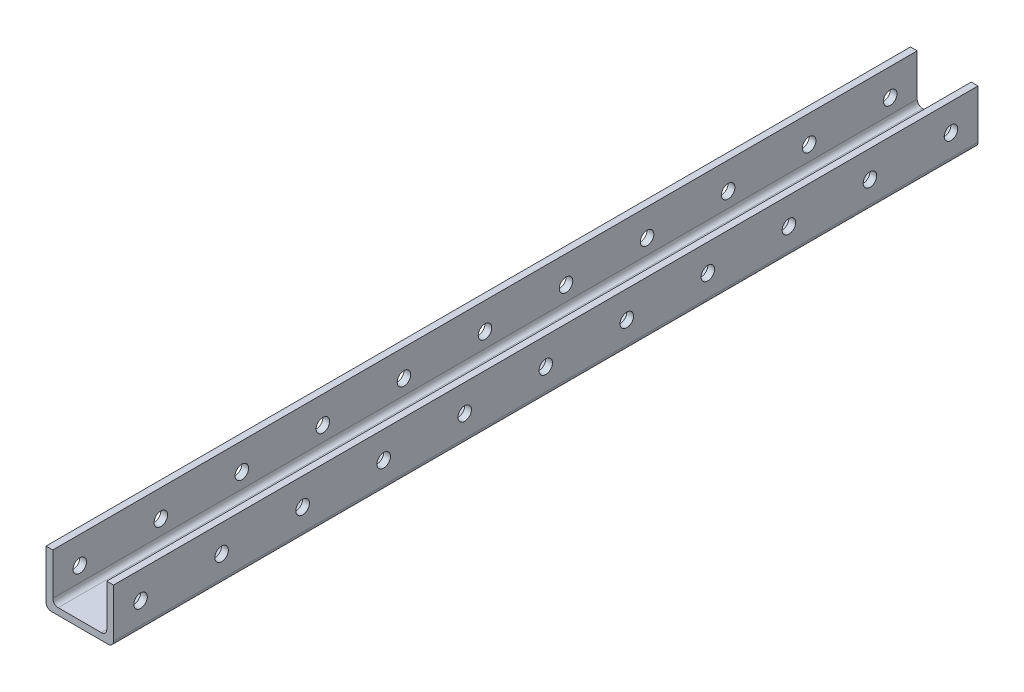
ISO-10303-21;
HEADER;
FILE_DESCRIPTION(('STEP AP214'),'2;1');
FILE_NAME('part.step','',(''),(''),'','','');
FILE_SCHEMA(('AUTOMOTIVE_DESIGN { 1 0 10303 214 1 1 1 1 }'));
ENDSEC;
DATA;
#1=APPLICATION_CONTEXT('core data for automotive mechanical design processes');
#2=APPLICATION_PROTOCOL_DEFINITION('international standard','automotive_design',2000,#1);
#3=PRODUCT_CONTEXT('',#1,'mechanical');
#4=PRODUCT('Part','Part','',(#3));
#5=PRODUCT_RELATED_PRODUCT_CATEGORY('part','',(#4));
#6=PRODUCT_DEFINITION_FORMATION('','',#4);
#7=PRODUCT_DEFINITION_CONTEXT('part definition',#1,'design');
#8=PRODUCT_DEFINITION('design','',#6,#7);
#9=PRODUCT_DEFINITION_SHAPE('','',#8);
#10=(LENGTH_UNIT() NAMED_UNIT(*) SI_UNIT(.MILLI.,.METRE.));
#11=(NAMED_UNIT(*) PLANE_ANGLE_UNIT() SI_UNIT($,.RADIAN.));
#12=(NAMED_UNIT(*) SI_UNIT($,.STERADIAN.) SOLID_ANGLE_UNIT());
#13=UNCERTAINTY_MEASURE_WITH_UNIT(LENGTH_MEASURE(1.E-05),#10,'distance_accuracy_value','');
#14=(GEOMETRIC_REPRESENTATION_CONTEXT(3) GLOBAL_UNCERTAINTY_ASSIGNED_CONTEXT((#13)) GLOBAL_UNIT_ASSIGNED_CONTEXT((#10,
#11,#12)) REPRESENTATION_CONTEXT('',''));
#15=CARTESIAN_POINT('',(0.,0.,0.));
#16=DIRECTION('',(0.,0.,1.));
#17=DIRECTION('',(1.,0.,0.));
#18=AXIS2_PLACEMENT_3D('',#15,#16,#17);
#19=CARTESIAN_POINT('',(0.,25.4,0.));
#20=DIRECTION('',(0.,-1.,0.));
#21=DIRECTION('',(0.,0.,-1.));
#22=AXIS2_PLACEMENT_3D('',#19,#20,#21);
#23=PLANE('',#22);
#24=DIRECTION('',(1.,0.,0.));
#25=VECTOR('',#24,1.);
#26=CARTESIAN_POINT('',(-15.875,25.4,203.2));
#27=LINE('',#26,#25);
#28=CARTESIAN_POINT('',(-15.875,25.4,203.2));
#29=VERTEX_POINT('',#28);
#30=CARTESIAN_POINT('',(-12.7,25.4,203.2));
#31=VERTEX_POINT('',#30);
#32=EDGE_CURVE('E158',#29,#31,#27,.T.);
#33=ORIENTED_EDGE('',*,*,#32,.T.);
#34=DIRECTION('',(0.,0.,1.));
#35=VECTOR('',#34,1.);
#36=CARTESIAN_POINT('',(-12.7,25.4,-203.2));
#37=LINE('',#36,#35);
#38=CARTESIAN_POINT('',(-12.7,25.4,-203.2));
#39=VERTEX_POINT('',#38);
#40=EDGE_CURVE('E145',#39,#31,#37,.T.);
#41=ORIENTED_EDGE('',*,*,#40,.F.);
#42=DIRECTION('',(-1.,0.,0.));
#43=VECTOR('',#42,1.);
#44=CARTESIAN_POINT('',(-15.875,25.4,-203.2));
#45=LINE('',#44,#43);
#46=CARTESIAN_POINT('',(-15.875,25.4,-203.2));
#47=VERTEX_POINT('',#46);
#48=EDGE_CURVE('E152',#39,#47,#45,.T.);
#49=ORIENTED_EDGE('',*,*,#48,.T.);
#50=DIRECTION('',(0.,0.,1.));
#51=VECTOR('',#50,1.);
#52=CARTESIAN_POINT('',(-15.875,25.4,203.2));
#53=LINE('',#52,#51);
#54=EDGE_CURVE('E151',#47,#29,#53,.T.);
#55=ORIENTED_EDGE('',*,*,#54,.T.);
#56=EDGE_LOOP('',(#33,#41,#49,#55));
#57=FACE_BOUND('',#56,.T.);
#58=ADVANCED_FACE('F33',(#57),#23,.F.);
#59=CARTESIAN_POINT('',(15.875,25.4,203.2));
#60=DIRECTION('',(-1.,0.,0.));
#61=DIRECTION('',(0.,0.,1.));
#62=AXIS2_PLACEMENT_3D('',#59,#60,#61);
#63=PLANE('',#62);
#64=CARTESIAN_POINT('',(15.875,12.7,-190.5));
#65=DIRECTION('',(1.,0.,0.));
#66=DIRECTION('',(0.,0.,-1.));
#67=AXIS2_PLACEMENT_3D('',#64,#65,#66);
#68=CIRCLE('',#67,3.175);
#69=CARTESIAN_POINT('',(15.875,12.7,-193.675));
#70=VERTEX_POINT('',#69);
#71=EDGE_CURVE('E512',#70,#70,#68,.T.);
#72=ORIENTED_EDGE('',*,*,#71,.F.);
#73=EDGE_LOOP('',(#72));
#74=FACE_BOUND('',#73,.T.);
#75=CARTESIAN_POINT('',(15.875,12.7,-152.4));
#76=DIRECTION('',(1.,0.,0.));
#77=DIRECTION('',(0.,0.,-1.));
#78=AXIS2_PLACEMENT_3D('',#75,#76,#77);
#79=CIRCLE('',#78,3.175);
#80=CARTESIAN_POINT('',(15.875,12.7,-155.575));
#81=VERTEX_POINT('',#80);
#82=EDGE_CURVE('E254',#81,#81,#79,.T.);
#83=ORIENTED_EDGE('',*,*,#82,.F.);
#84=EDGE_LOOP('',(#83));
#85=FACE_BOUND('',#84,.T.);
#86=CARTESIAN_POINT('',(15.875,12.7,-114.3));
#87=DIRECTION('',(1.,0.,0.));
#88=DIRECTION('',(0.,0.,-1.));
#89=AXIS2_PLACEMENT_3D('',#86,#87,#88);
#90=CIRCLE('',#89,3.175);
#91=CARTESIAN_POINT('',(15.875,12.7,-117.475));
#92=VERTEX_POINT('',#91);
#93=EDGE_CURVE('E250',#92,#92,#90,.T.);
#94=ORIENTED_EDGE('',*,*,#93,.F.);
#95=EDGE_LOOP('',(#94));
#96=FACE_BOUND('',#95,.T.);
#97=CARTESIAN_POINT('',(15.875,12.7,-76.2000000000001));
#98=DIRECTION('',(1.,0.,0.));
#99=DIRECTION('',(0.,0.,-1.));
#100=AXIS2_PLACEMENT_3D('',#97,#98,#99);
#101=CIRCLE('',#100,3.175);
#102=CARTESIAN_POINT('',(15.875,12.7,-79.3750000000001));
#103=VERTEX_POINT('',#102);
#104=EDGE_CURVE('E246',#103,#103,#101,.T.);
#105=ORIENTED_EDGE('',*,*,#104,.F.);
#106=EDGE_LOOP('',(#105));
#107=FACE_BOUND('',#106,.T.);
#108=CARTESIAN_POINT('',(15.875,12.7,-38.1000000000001));
#109=DIRECTION('',(1.,0.,0.));
#110=DIRECTION('',(0.,0.,-1.));
#111=AXIS2_PLACEMENT_3D('',#108,#109,#110);
#112=CIRCLE('',#111,3.175);
#113=CARTESIAN_POINT('',(15.875,12.7,-41.2750000000001));
#114=VERTEX_POINT('',#113);
#115=EDGE_CURVE('E241',#114,#114,#112,.T.);
#116=ORIENTED_EDGE('',*,*,#115,.F.);
#117=EDGE_LOOP('',(#116));
#118=FACE_BOUND('',#117,.T.);
#119=CARTESIAN_POINT('',(15.875,12.7,-1.11022302462516E-13));
#120=DIRECTION('',(1.,0.,0.));
#121=DIRECTION('',(0.,0.,-1.));
#122=AXIS2_PLACEMENT_3D('',#119,#120,#121);
#123=CIRCLE('',#122,3.175);
#124=CARTESIAN_POINT('',(15.875,12.7,-3.17500000000011));
#125=VERTEX_POINT('',#124);
#126=EDGE_CURVE('E236',#125,#125,#123,.T.);
#127=ORIENTED_EDGE('',*,*,#126,.F.);
#128=EDGE_LOOP('',(#127));
#129=FACE_BOUND('',#128,.T.);
#130=CARTESIAN_POINT('',(15.875,12.7,38.0999999999999));
#131=DIRECTION('',(1.,0.,0.));
#132=DIRECTION('',(0.,0.,-1.));
#133=AXIS2_PLACEMENT_3D('',#130,#131,#132);
#134=CIRCLE('',#133,3.175);
#135=CARTESIAN_POINT('',(15.875,12.7,34.9249999999999));
#136=VERTEX_POINT('',#135);
#137=EDGE_CURVE('E231',#136,#136,#134,.T.);
#138=ORIENTED_EDGE('',*,*,#137,.F.);
#139=EDGE_LOOP('',(#138));
#140=FACE_BOUND('',#139,.T.);
#141=CARTESIAN_POINT('',(15.875,12.7,76.1999999999999));
#142=DIRECTION('',(1.,0.,0.));
#143=DIRECTION('',(0.,0.,-1.));
#144=AXIS2_PLACEMENT_3D('',#141,#142,#143);
#145=CIRCLE('',#144,3.175);
#146=CARTESIAN_POINT('',(15.875,12.7,73.0249999999999));
#147=VERTEX_POINT('',#146);
#148=EDGE_CURVE('E226',#147,#147,#145,.T.);
#149=ORIENTED_EDGE('',*,*,#148,.F.);
#150=EDGE_LOOP('',(#149));
#151=FACE_BOUND('',#150,.T.);
#152=CARTESIAN_POINT('',(15.875,12.7,114.3));
#153=DIRECTION('',(1.,0.,0.));
#154=DIRECTION('',(0.,0.,-1.));
#155=AXIS2_PLACEMENT_3D('',#152,#153,#154);
#156=CIRCLE('',#155,3.175);
#157=CARTESIAN_POINT('',(15.875,12.7,111.125));
#158=VERTEX_POINT('',#157);
#159=EDGE_CURVE('E221',#158,#158,#156,.T.);
#160=ORIENTED_EDGE('',*,*,#159,.F.);
#161=EDGE_LOOP('',(#160));
#162=FACE_BOUND('',#161,.T.);
#163=CARTESIAN_POINT('',(15.875,12.7,152.4));
#164=DIRECTION('',(1.,0.,0.));
#165=DIRECTION('',(0.,0.,-1.));
#166=AXIS2_PLACEMENT_3D('',#163,#164,#165);
#167=CIRCLE('',#166,3.175);
#168=CARTESIAN_POINT('',(15.875,12.7,149.225));
#169=VERTEX_POINT('',#168);
#170=EDGE_CURVE('E216',#169,#169,#167,.T.);
#171=ORIENTED_EDGE('',*,*,#170,.F.);
#172=EDGE_LOOP('',(#171));
#173=FACE_BOUND('',#172,.T.);
#174=CARTESIAN_POINT('',(15.875,12.7,190.5));
#175=DIRECTION('',(1.,0.,0.));
#176=DIRECTION('',(0.,0.,-1.));
#177=AXIS2_PLACEMENT_3D('',#174,#175,#176);
#178=CIRCLE('',#177,3.175);
#179=CARTESIAN_POINT('',(15.875,12.7,187.325));
#180=VERTEX_POINT('',#179);
#181=EDGE_CURVE('E211',#180,#180,#178,.T.);
#182=ORIENTED_EDGE('',*,*,#181,.F.);
#183=EDGE_LOOP('',(#182));
#184=FACE_BOUND('',#183,.T.);
#185=DIRECTION('',(0.,-1.,0.));
#186=VECTOR('',#185,1.);
#187=CARTESIAN_POINT('',(15.875,25.4,203.2));
#188=LINE('',#187,#186);
#189=CARTESIAN_POINT('',(15.875,25.4,203.2));
#190=VERTEX_POINT('',#189);
#191=CARTESIAN_POINT('',(15.875,2.54,203.2));
#192=VERTEX_POINT('',#191);
#193=EDGE_CURVE('E161',#190,#192,#188,.T.);
#194=ORIENTED_EDGE('',*,*,#193,.T.);
#195=DIRECTION('',(0.,0.,-1.));
#196=VECTOR('',#195,1.);
#197=CARTESIAN_POINT('',(15.875,2.54,-203.2));
#198=LINE('',#197,#196);
#199=CARTESIAN_POINT('',(15.875,2.54,-203.2));
#200=VERTEX_POINT('',#199);
#201=EDGE_CURVE('E192',#192,#200,#198,.T.);
#202=ORIENTED_EDGE('',*,*,#201,.T.);
#203=DIRECTION('',(0.,-1.,0.));
#204=VECTOR('',#203,1.);
#205=CARTESIAN_POINT('',(15.875,25.4,-203.2));
#206=LINE('',#205,#204);
#207=CARTESIAN_POINT('',(15.875,25.4,-203.2));
#208=VERTEX_POINT('',#207);
#209=EDGE_CURVE('E175',#208,#200,#206,.T.);
#210=ORIENTED_EDGE('',*,*,#209,.F.);
#211=DIRECTION('',(0.,0.,-1.));
#212=VECTOR('',#211,1.);
#213=CARTESIAN_POINT('',(15.875,25.4,203.2));
#214=LINE('',#213,#212);
#215=EDGE_CURVE('E149',#190,#208,#214,.T.);
#216=ORIENTED_EDGE('',*,*,#215,.F.);
#217=EDGE_LOOP('',(#194,#202,#210,#216));
#218=FACE_BOUND('',#217,.T.);
#219=ADVANCED_FACE('F371',(#74,#85,#96,#107,#118,#129,#140,#151,#162,#173,#184,#218),#63,.F.);
#220=CARTESIAN_POINT('',(-15.875,25.4,-203.2));
#221=DIRECTION('',(0.,0.,1.));
#222=DIRECTION('',(1.,0.,0.));
#223=AXIS2_PLACEMENT_3D('',#220,#221,#222);
#224=PLANE('',#223);
#225=DIRECTION('',(-1.,0.,0.));
#226=VECTOR('',#225,1.);
#227=CARTESIAN_POINT('',(-15.875,0.,-203.2));
#228=LINE('',#227,#226);
#229=CARTESIAN_POINT('',(13.335,0.,-203.2));
#230=VERTEX_POINT('',#229);
#231=CARTESIAN_POINT('',(-13.335,0.,-203.2));
#232=VERTEX_POINT('',#231);
#233=EDGE_CURVE('E162',#230,#232,#228,.T.);
#234=ORIENTED_EDGE('',*,*,#233,.T.);
#235=CARTESIAN_POINT('',(-13.335,2.54,-203.2));
#236=DIRECTION('',(0.,0.,1.));
#237=DIRECTION('',(1.,0.,0.));
#238=AXIS2_PLACEMENT_3D('',#235,#236,#237);
#239=CIRCLE('',#238,2.54);
#240=CARTESIAN_POINT('',(-15.875,2.54,-203.2));
#241=VERTEX_POINT('',#240);
#242=EDGE_CURVE('E190',#232,#241,#239,.F.);
#243=ORIENTED_EDGE('',*,*,#242,.T.);
#244=DIRECTION('',(0.,-1.,0.));
#245=VECTOR('',#244,1.);
#246=CARTESIAN_POINT('',(-15.875,25.4,-203.2));
#247=LINE('',#246,#245);
#248=EDGE_CURVE('E172',#47,#241,#247,.T.);
#249=ORIENTED_EDGE('',*,*,#248,.F.);
#250=ORIENTED_EDGE('',*,*,#48,.F.);
#251=DIRECTION('',(0.,-1.,0.));
#252=VECTOR('',#251,1.);
#253=CARTESIAN_POINT('',(-12.7,25.4,-203.2));
#254=LINE('',#253,#252);
#255=CARTESIAN_POINT('',(-12.7,5.715,-203.2));
#256=VERTEX_POINT('',#255);
#257=EDGE_CURVE('E336',#39,#256,#254,.T.);
#258=ORIENTED_EDGE('',*,*,#257,.T.);
#259=CARTESIAN_POINT('',(-10.16,5.715,-203.2));
#260=DIRECTION('',(0.,0.,1.));
#261=DIRECTION('',(1.,0.,0.));
#262=AXIS2_PLACEMENT_3D('',#259,#260,#261);
#263=CIRCLE('',#262,2.54);
#264=CARTESIAN_POINT('',(-10.16,3.175,-203.2));
#265=VERTEX_POINT('',#264);
#266=EDGE_CURVE('E11',#256,#265,#263,.T.);
#267=ORIENTED_EDGE('',*,*,#266,.T.);
#268=DIRECTION('',(1.,0.,0.));
#269=VECTOR('',#268,1.);
#270=CARTESIAN_POINT('',(-12.7,3.175,-203.2));
#271=LINE('',#270,#269);
#272=CARTESIAN_POINT('',(10.16,3.175,-203.2));
#273=VERTEX_POINT('',#272);
#274=EDGE_CURVE('E137',#265,#273,#271,.T.);
#275=ORIENTED_EDGE('',*,*,#274,.T.);
#276=CARTESIAN_POINT('',(10.16,5.715,-203.2));
#277=DIRECTION('',(0.,0.,1.));
#278=DIRECTION('',(1.,0.,0.));
#279=AXIS2_PLACEMENT_3D('',#276,#277,#278);
#280=CIRCLE('',#279,2.54);
#281=CARTESIAN_POINT('',(12.7,5.715,-203.2));
#282=VERTEX_POINT('',#281);
#283=EDGE_CURVE('E132',#273,#282,#280,.T.);
#284=ORIENTED_EDGE('',*,*,#283,.T.);
#285=DIRECTION('',(0.,1.,0.));
#286=VECTOR('',#285,1.);
#287=CARTESIAN_POINT('',(12.7,25.4,-203.2));
#288=LINE('',#287,#286);
#289=CARTESIAN_POINT('',(12.7,25.4,-203.2));
#290=VERTEX_POINT('',#289);
#291=EDGE_CURVE('E122',#282,#290,#288,.T.);
#292=ORIENTED_EDGE('',*,*,#291,.T.);
#293=EDGE_CURVE('E128',#208,#290,#45,.T.);
#294=ORIENTED_EDGE('',*,*,#293,.F.);
#295=ORIENTED_EDGE('',*,*,#209,.T.);
#296=CARTESIAN_POINT('',(13.335,2.54,-203.2));
#297=DIRECTION('',(0.,0.,1.));
#298=DIRECTION('',(1.,0.,0.));
#299=AXIS2_PLACEMENT_3D('',#296,#297,#298);
#300=CIRCLE('',#299,2.54);
#301=EDGE_CURVE('E188',#200,#230,#300,.F.);
#302=ORIENTED_EDGE('',*,*,#301,.T.);
#303=EDGE_LOOP('',(#234,#243,#249,#250,#258,#267,#275,#284,#292,#294,#295,#302));
#304=FACE_BOUND('',#303,.T.);
#305=ADVANCED_FACE('F125',(#304),#224,.F.);
#306=CARTESIAN_POINT('',(-15.875,25.4,203.2));
#307=DIRECTION('',(1.,0.,0.));
#308=DIRECTION('',(0.,0.,-1.));
#309=AXIS2_PLACEMENT_3D('',#306,#307,#308);
#310=PLANE('',#309);
#311=CARTESIAN_POINT('',(-15.875,12.7,-190.5));
#312=DIRECTION('',(1.,0.,0.));
#313=DIRECTION('',(0.,0.,-1.));
#314=AXIS2_PLACEMENT_3D('',#311,#312,#313);
#315=CIRCLE('',#314,3.175);
#316=CARTESIAN_POINT('',(-15.875,12.7,-193.675));
#317=VERTEX_POINT('',#316);
#318=EDGE_CURVE('E261',#317,#317,#315,.T.);
#319=ORIENTED_EDGE('',*,*,#318,.T.);
#320=EDGE_LOOP('',(#319));
#321=FACE_BOUND('',#320,.T.);
#322=CARTESIAN_POINT('',(-15.875,12.7,-152.4));
#323=DIRECTION('',(1.,0.,0.));
#324=DIRECTION('',(0.,0.,-1.));
#325=AXIS2_PLACEMENT_3D('',#322,#323,#324);
#326=CIRCLE('',#325,3.175);
#327=CARTESIAN_POINT('',(-15.875,12.7,-155.575));
#328=VERTEX_POINT('',#327);
#329=EDGE_CURVE('E258',#328,#328,#326,.T.);
#330=ORIENTED_EDGE('',*,*,#329,.T.);
#331=EDGE_LOOP('',(#330));
#332=FACE_BOUND('',#331,.T.);
#333=CARTESIAN_POINT('',(-15.875,12.7,-114.3));
#334=DIRECTION('',(1.,0.,0.));
#335=DIRECTION('',(0.,0.,-1.));
#336=AXIS2_PLACEMENT_3D('',#333,#334,#335);
#337=CIRCLE('',#336,3.175);
#338=CARTESIAN_POINT('',(-15.875,12.7,-117.475));
#339=VERTEX_POINT('',#338);
#340=EDGE_CURVE('E276',#339,#339,#337,.T.);
#341=ORIENTED_EDGE('',*,*,#340,.T.);
#342=EDGE_LOOP('',(#341));
#343=FACE_BOUND('',#342,.T.);
#344=CARTESIAN_POINT('',(-15.875,12.7,-76.2000000000001));
#345=DIRECTION('',(1.,0.,0.));
#346=DIRECTION('',(0.,0.,-1.));
#347=AXIS2_PLACEMENT_3D('',#344,#345,#346);
#348=CIRCLE('',#347,3.175);
#349=CARTESIAN_POINT('',(-15.875,12.7,-79.3750000000001));
#350=VERTEX_POINT('',#349);
#351=EDGE_CURVE('E283',#350,#350,#348,.T.);
#352=ORIENTED_EDGE('',*,*,#351,.T.);
#353=EDGE_LOOP('',(#352));
#354=FACE_BOUND('',#353,.T.);
#355=CARTESIAN_POINT('',(-15.875,12.7,-38.1000000000001));
#356=DIRECTION('',(1.,0.,0.));
#357=DIRECTION('',(0.,0.,-1.));
#358=AXIS2_PLACEMENT_3D('',#355,#356,#357);
#359=CIRCLE('',#358,3.175);
#360=CARTESIAN_POINT('',(-15.875,12.7,-41.2750000000001));
#361=VERTEX_POINT('',#360);
#362=EDGE_CURVE('E290',#361,#361,#359,.T.);
#363=ORIENTED_EDGE('',*,*,#362,.T.);
#364=EDGE_LOOP('',(#363));
#365=FACE_BOUND('',#364,.T.);
#366=CARTESIAN_POINT('',(-15.875,12.7,-1.11022302462516E-13));
#367=DIRECTION('',(1.,0.,0.));
#368=DIRECTION('',(0.,0.,-1.));
#369=AXIS2_PLACEMENT_3D('',#366,#367,#368);
#370=CIRCLE('',#369,3.175);
#371=CARTESIAN_POINT('',(-15.875,12.7,-3.17500000000011));
#372=VERTEX_POINT('',#371);
#373=EDGE_CURVE('E297',#372,#372,#370,.T.);
#374=ORIENTED_EDGE('',*,*,#373,.T.);
#375=EDGE_LOOP('',(#374));
#376=FACE_BOUND('',#375,.T.);
#377=CARTESIAN_POINT('',(-15.875,12.7,38.0999999999999));
#378=DIRECTION('',(1.,0.,0.));
#379=DIRECTION('',(0.,0.,-1.));
#380=AXIS2_PLACEMENT_3D('',#377,#378,#379);
#381=CIRCLE('',#380,3.175);
#382=CARTESIAN_POINT('',(-15.875,12.7,34.9249999999999));
#383=VERTEX_POINT('',#382);
#384=EDGE_CURVE('E304',#383,#383,#381,.T.);
#385=ORIENTED_EDGE('',*,*,#384,.T.);
#386=EDGE_LOOP('',(#385));
#387=FACE_BOUND('',#386,.T.);
#388=CARTESIAN_POINT('',(-15.875,12.7,76.1999999999999));
#389=DIRECTION('',(1.,0.,0.));
#390=DIRECTION('',(0.,0.,-1.));
#391=AXIS2_PLACEMENT_3D('',#388,#389,#390);
#392=CIRCLE('',#391,3.175);
#393=CARTESIAN_POINT('',(-15.875,12.7,73.0249999999999));
#394=VERTEX_POINT('',#393);
#395=EDGE_CURVE('E311',#394,#394,#392,.T.);
#396=ORIENTED_EDGE('',*,*,#395,.T.);
#397=EDGE_LOOP('',(#396));
#398=FACE_BOUND('',#397,.T.);
#399=CARTESIAN_POINT('',(-15.875,12.7,114.3));
#400=DIRECTION('',(1.,0.,0.));
#401=DIRECTION('',(0.,0.,-1.));
#402=AXIS2_PLACEMENT_3D('',#399,#400,#401);
#403=CIRCLE('',#402,3.175);
#404=CARTESIAN_POINT('',(-15.875,12.7,111.125));
#405=VERTEX_POINT('',#404);
#406=EDGE_CURVE('E318',#405,#405,#403,.T.);
#407=ORIENTED_EDGE('',*,*,#406,.T.);
#408=EDGE_LOOP('',(#407));
#409=FACE_BOUND('',#408,.T.);
#410=CARTESIAN_POINT('',(-15.875,12.7,152.4));
#411=DIRECTION('',(1.,0.,0.));
#412=DIRECTION('',(0.,0.,-1.));
#413=AXIS2_PLACEMENT_3D('',#410,#411,#412);
#414=CIRCLE('',#413,3.175);
#415=CARTESIAN_POINT('',(-15.875,12.7,149.225));
#416=VERTEX_POINT('',#415);
#417=EDGE_CURVE('E325',#416,#416,#414,.T.);
#418=ORIENTED_EDGE('',*,*,#417,.T.);
#419=EDGE_LOOP('',(#418));
#420=FACE_BOUND('',#419,.T.);
#421=CARTESIAN_POINT('',(-15.875,12.7,190.5));
#422=DIRECTION('',(1.,0.,0.));
#423=DIRECTION('',(0.,0.,-1.));
#424=AXIS2_PLACEMENT_3D('',#421,#422,#423);
#425=CIRCLE('',#424,3.175);
#426=CARTESIAN_POINT('',(-15.875,12.7,187.325));
#427=VERTEX_POINT('',#426);
#428=EDGE_CURVE('E332',#427,#427,#425,.T.);
#429=ORIENTED_EDGE('',*,*,#428,.T.);
#430=EDGE_LOOP('',(#429));
#431=FACE_BOUND('',#430,.T.);
#432=ORIENTED_EDGE('',*,*,#248,.T.);
#433=DIRECTION('',(0.,0.,1.));
#434=VECTOR('',#433,1.);
#435=CARTESIAN_POINT('',(-15.875,2.54,203.2));
#436=LINE('',#435,#434);
#437=CARTESIAN_POINT('',(-15.875,2.54,203.2));
#438=VERTEX_POINT('',#437);
#439=EDGE_CURVE('E177',#241,#438,#436,.T.);
#440=ORIENTED_EDGE('',*,*,#439,.T.);
#441=DIRECTION('',(0.,-1.,0.));
#442=VECTOR('',#441,1.);
#443=CARTESIAN_POINT('',(-15.875,25.4,203.2));
#444=LINE('',#443,#442);
#445=EDGE_CURVE('E169',#29,#438,#444,.T.);
#446=ORIENTED_EDGE('',*,*,#445,.F.);
#447=ORIENTED_EDGE('',*,*,#54,.F.);
#448=EDGE_LOOP('',(#432,#440,#446,#447));
#449=FACE_BOUND('',#448,.T.);
#450=ADVANCED_FACE('F354',(#321,#332,#343,#354,#365,#376,#387,#398,#409,#420,#431,#449),#310,.F.);
#451=CARTESIAN_POINT('',(-15.875,25.4,203.2));
#452=DIRECTION('',(0.,0.,-1.));
#453=DIRECTION('',(-1.,0.,0.));
#454=AXIS2_PLACEMENT_3D('',#451,#452,#453);
#455=PLANE('',#454);
#456=ORIENTED_EDGE('',*,*,#445,.T.);
#457=CARTESIAN_POINT('',(-13.335,2.54,203.2));
#458=DIRECTION('',(0.,0.,-1.));
#459=DIRECTION('',(-1.,0.,0.));
#460=AXIS2_PLACEMENT_3D('',#457,#458,#459);
#461=CIRCLE('',#460,2.54);
#462=CARTESIAN_POINT('',(-13.335,0.,203.2));
#463=VERTEX_POINT('',#462);
#464=EDGE_CURVE('E182',#438,#463,#461,.F.);
#465=ORIENTED_EDGE('',*,*,#464,.T.);
#466=DIRECTION('',(1.,0.,0.));
#467=VECTOR('',#466,1.);
#468=CARTESIAN_POINT('',(-15.875,0.,203.2));
#469=LINE('',#468,#467);
#470=CARTESIAN_POINT('',(13.335,0.,203.2));
#471=VERTEX_POINT('',#470);
#472=EDGE_CURVE('E164',#463,#471,#469,.T.);
#473=ORIENTED_EDGE('',*,*,#472,.T.);
#474=CARTESIAN_POINT('',(13.335,2.54,203.2));
#475=DIRECTION('',(0.,0.,-1.));
#476=DIRECTION('',(-1.,0.,0.));
#477=AXIS2_PLACEMENT_3D('',#474,#475,#476);
#478=CIRCLE('',#477,2.54);
#479=EDGE_CURVE('E180',#471,#192,#478,.F.);
#480=ORIENTED_EDGE('',*,*,#479,.T.);
#481=ORIENTED_EDGE('',*,*,#193,.F.);
#482=CARTESIAN_POINT('',(12.7,25.4,203.2));
#483=VERTEX_POINT('',#482);
#484=EDGE_CURVE('E154',#483,#190,#27,.T.);
#485=ORIENTED_EDGE('',*,*,#484,.F.);
#486=DIRECTION('',(0.,1.,0.));
#487=VECTOR('',#486,1.);
#488=CARTESIAN_POINT('',(12.7,25.4,203.2));
#489=LINE('',#488,#487);
#490=CARTESIAN_POINT('',(12.7,5.715,203.2));
#491=VERTEX_POINT('',#490);
#492=EDGE_CURVE('E142',#491,#483,#489,.T.);
#493=ORIENTED_EDGE('',*,*,#492,.F.);
#494=CARTESIAN_POINT('',(10.16,5.715,203.2));
#495=DIRECTION('',(0.,0.,-1.));
#496=DIRECTION('',(-1.,0.,0.));
#497=AXIS2_PLACEMENT_3D('',#494,#495,#496);
#498=CIRCLE('',#497,2.54);
#499=CARTESIAN_POINT('',(10.16,3.175,203.2));
#500=VERTEX_POINT('',#499);
#501=EDGE_CURVE('E203',#491,#500,#498,.T.);
#502=ORIENTED_EDGE('',*,*,#501,.T.);
#503=DIRECTION('',(1.,0.,0.));
#504=VECTOR('',#503,1.);
#505=CARTESIAN_POINT('',(-12.7,3.175,203.2));
#506=LINE('',#505,#504);
#507=CARTESIAN_POINT('',(-10.16,3.175,203.2));
#508=VERTEX_POINT('',#507);
#509=EDGE_CURVE('E340',#508,#500,#506,.T.);
#510=ORIENTED_EDGE('',*,*,#509,.F.);
#511=CARTESIAN_POINT('',(-10.16,5.715,203.2));
#512=DIRECTION('',(0.,0.,-1.));
#513=DIRECTION('',(-1.,0.,0.));
#514=AXIS2_PLACEMENT_3D('',#511,#512,#513);
#515=CIRCLE('',#514,2.54);
#516=CARTESIAN_POINT('',(-12.7,5.715,203.2));
#517=VERTEX_POINT('',#516);
#518=EDGE_CURVE('E42',#508,#517,#515,.T.);
#519=ORIENTED_EDGE('',*,*,#518,.T.);
#520=DIRECTION('',(0.,-1.,0.));
#521=VECTOR('',#520,1.);
#522=CARTESIAN_POINT('',(-12.7,25.4,203.2));
#523=LINE('',#522,#521);
#524=EDGE_CURVE('E335',#31,#517,#523,.T.);
#525=ORIENTED_EDGE('',*,*,#524,.F.);
#526=ORIENTED_EDGE('',*,*,#32,.F.);
#527=EDGE_LOOP('',(#456,#465,#473,#480,#481,#485,#493,#502,#510,#519,#525,#526));
#528=FACE_BOUND('',#527,.T.);
#529=ADVANCED_FACE('F349',(#528),#455,.F.);
#530=ORIENTED_EDGE('',*,*,#293,.T.);
#531=DIRECTION('',(0.,0.,1.));
#532=VECTOR('',#531,1.);
#533=CARTESIAN_POINT('',(12.7,25.4,-203.2));
#534=LINE('',#533,#532);
#535=EDGE_CURVE('E136',#290,#483,#534,.T.);
#536=ORIENTED_EDGE('',*,*,#535,.T.);
#537=ORIENTED_EDGE('',*,*,#484,.T.);
#538=ORIENTED_EDGE('',*,*,#215,.T.);
#539=EDGE_LOOP('',(#530,#536,#537,#538));
#540=FACE_BOUND('',#539,.T.);
#541=ADVANCED_FACE('F147',(#540),#23,.F.);
#542=CARTESIAN_POINT('',(0.,0.,0.));
#543=DIRECTION('',(0.,-1.,0.));
#544=DIRECTION('',(0.,0.,-1.));
#545=AXIS2_PLACEMENT_3D('',#542,#543,#544);
#546=PLANE('',#545);
#547=ORIENTED_EDGE('',*,*,#472,.F.);
#548=DIRECTION('',(0.,0.,1.));
#549=VECTOR('',#548,1.);
#550=CARTESIAN_POINT('',(-13.335,0.,-203.2));
#551=LINE('',#550,#549);
#552=EDGE_CURVE('E186',#463,#232,#551,.F.);
#553=ORIENTED_EDGE('',*,*,#552,.T.);
#554=ORIENTED_EDGE('',*,*,#233,.F.);
#555=DIRECTION('',(0.,0.,-1.));
#556=VECTOR('',#555,1.);
#557=CARTESIAN_POINT('',(13.335,0.,203.2));
#558=LINE('',#557,#556);
#559=EDGE_CURVE('E184',#230,#471,#558,.F.);
#560=ORIENTED_EDGE('',*,*,#559,.T.);
#561=EDGE_LOOP('',(#547,#553,#554,#560));
#562=FACE_BOUND('',#561,.T.);
#563=ADVANCED_FACE('F361',(#562),#546,.T.);
#564=CARTESIAN_POINT('',(-12.7,25.4,-203.2));
#565=DIRECTION('',(-1.,0.,0.));
#566=DIRECTION('',(0.,-1.,0.));
#567=AXIS2_PLACEMENT_3D('',#564,#565,#566);
#568=PLANE('',#567);
#569=CARTESIAN_POINT('',(-12.7,12.7,-190.5));
#570=DIRECTION('',(-1.,0.,0.));
#571=DIRECTION('',(0.,-1.,0.));
#572=AXIS2_PLACEMENT_3D('',#569,#570,#571);
#573=CIRCLE('',#572,3.175);
#574=CARTESIAN_POINT('',(-12.7,9.525,-190.5));
#575=VERTEX_POINT('',#574);
#576=EDGE_CURVE('E266',#575,#575,#573,.T.);
#577=ORIENTED_EDGE('',*,*,#576,.T.);
#578=EDGE_LOOP('',(#577));
#579=FACE_BOUND('',#578,.T.);
#580=CARTESIAN_POINT('',(-12.7,12.7,-152.4));
#581=DIRECTION('',(-1.,0.,0.));
#582=DIRECTION('',(0.,-1.,0.));
#583=AXIS2_PLACEMENT_3D('',#580,#581,#582);
#584=CIRCLE('',#583,3.175);
#585=CARTESIAN_POINT('',(-12.7,9.525,-152.4));
#586=VERTEX_POINT('',#585);
#587=EDGE_CURVE('E253',#586,#586,#584,.T.);
#588=ORIENTED_EDGE('',*,*,#587,.T.);
#589=EDGE_LOOP('',(#588));
#590=FACE_BOUND('',#589,.T.);
#591=CARTESIAN_POINT('',(-12.7,12.7,-114.3));
#592=DIRECTION('',(-1.,0.,0.));
#593=DIRECTION('',(0.,-1.,0.));
#594=AXIS2_PLACEMENT_3D('',#591,#592,#593);
#595=CIRCLE('',#594,3.175);
#596=CARTESIAN_POINT('',(-12.7,9.525,-114.3));
#597=VERTEX_POINT('',#596);
#598=EDGE_CURVE('E249',#597,#597,#595,.T.);
#599=ORIENTED_EDGE('',*,*,#598,.T.);
#600=EDGE_LOOP('',(#599));
#601=FACE_BOUND('',#600,.T.);
#602=CARTESIAN_POINT('',(-12.7,12.7,-76.2000000000001));
#603=DIRECTION('',(-1.,0.,0.));
#604=DIRECTION('',(0.,-1.,0.));
#605=AXIS2_PLACEMENT_3D('',#602,#603,#604);
#606=CIRCLE('',#605,3.175);
#607=CARTESIAN_POINT('',(-12.7,9.525,-76.2000000000001));
#608=VERTEX_POINT('',#607);
#609=EDGE_CURVE('E245',#608,#608,#606,.T.);
#610=ORIENTED_EDGE('',*,*,#609,.T.);
#611=EDGE_LOOP('',(#610));
#612=FACE_BOUND('',#611,.T.);
#613=CARTESIAN_POINT('',(-12.7,12.7,-38.1000000000001));
#614=DIRECTION('',(-1.,0.,0.));
#615=DIRECTION('',(0.,-1.,0.));
#616=AXIS2_PLACEMENT_3D('',#613,#614,#615);
#617=CIRCLE('',#616,3.175);
#618=CARTESIAN_POINT('',(-12.7,9.525,-38.1000000000001));
#619=VERTEX_POINT('',#618);
#620=EDGE_CURVE('E240',#619,#619,#617,.T.);
#621=ORIENTED_EDGE('',*,*,#620,.T.);
#622=EDGE_LOOP('',(#621));
#623=FACE_BOUND('',#622,.T.);
#624=CARTESIAN_POINT('',(-12.7,12.7,-1.11022302462516E-13));
#625=DIRECTION('',(-1.,0.,0.));
#626=DIRECTION('',(0.,-1.,0.));
#627=AXIS2_PLACEMENT_3D('',#624,#625,#626);
#628=CIRCLE('',#627,3.175);
#629=CARTESIAN_POINT('',(-12.7,9.525,-1.11022302462516E-13));
#630=VERTEX_POINT('',#629);
#631=EDGE_CURVE('E235',#630,#630,#628,.T.);
#632=ORIENTED_EDGE('',*,*,#631,.T.);
#633=EDGE_LOOP('',(#632));
#634=FACE_BOUND('',#633,.T.);
#635=CARTESIAN_POINT('',(-12.7,12.7,38.0999999999999));
#636=DIRECTION('',(-1.,0.,0.));
#637=DIRECTION('',(0.,-1.,0.));
#638=AXIS2_PLACEMENT_3D('',#635,#636,#637);
#639=CIRCLE('',#638,3.175);
#640=CARTESIAN_POINT('',(-12.7,9.525,38.0999999999999));
#641=VERTEX_POINT('',#640);
#642=EDGE_CURVE('E230',#641,#641,#639,.T.);
#643=ORIENTED_EDGE('',*,*,#642,.T.);
#644=EDGE_LOOP('',(#643));
#645=FACE_BOUND('',#644,.T.);
#646=CARTESIAN_POINT('',(-12.7,12.7,76.1999999999999));
#647=DIRECTION('',(-1.,0.,0.));
#648=DIRECTION('',(0.,-1.,0.));
#649=AXIS2_PLACEMENT_3D('',#646,#647,#648);
#650=CIRCLE('',#649,3.175);
#651=CARTESIAN_POINT('',(-12.7,9.525,76.1999999999999));
#652=VERTEX_POINT('',#651);
#653=EDGE_CURVE('E225',#652,#652,#650,.T.);
#654=ORIENTED_EDGE('',*,*,#653,.T.);
#655=EDGE_LOOP('',(#654));
#656=FACE_BOUND('',#655,.T.);
#657=CARTESIAN_POINT('',(-12.7,12.7,114.3));
#658=DIRECTION('',(-1.,0.,0.));
#659=DIRECTION('',(0.,-1.,0.));
#660=AXIS2_PLACEMENT_3D('',#657,#658,#659);
#661=CIRCLE('',#660,3.175);
#662=CARTESIAN_POINT('',(-12.7,9.525,114.3));
#663=VERTEX_POINT('',#662);
#664=EDGE_CURVE('E220',#663,#663,#661,.T.);
#665=ORIENTED_EDGE('',*,*,#664,.T.);
#666=EDGE_LOOP('',(#665));
#667=FACE_BOUND('',#666,.T.);
#668=CARTESIAN_POINT('',(-12.7,12.7,152.4));
#669=DIRECTION('',(-1.,0.,0.));
#670=DIRECTION('',(0.,-1.,0.));
#671=AXIS2_PLACEMENT_3D('',#668,#669,#670);
#672=CIRCLE('',#671,3.175);
#673=CARTESIAN_POINT('',(-12.7,9.525,152.4));
#674=VERTEX_POINT('',#673);
#675=EDGE_CURVE('E215',#674,#674,#672,.T.);
#676=ORIENTED_EDGE('',*,*,#675,.T.);
#677=EDGE_LOOP('',(#676));
#678=FACE_BOUND('',#677,.T.);
#679=CARTESIAN_POINT('',(-12.7,12.7,190.5));
#680=DIRECTION('',(-1.,0.,0.));
#681=DIRECTION('',(0.,-1.,0.));
#682=AXIS2_PLACEMENT_3D('',#679,#680,#681);
#683=CIRCLE('',#682,3.175);
#684=CARTESIAN_POINT('',(-12.7,9.525,190.5));
#685=VERTEX_POINT('',#684);
#686=EDGE_CURVE('E210',#685,#685,#683,.T.);
#687=ORIENTED_EDGE('',*,*,#686,.T.);
#688=EDGE_LOOP('',(#687));
#689=FACE_BOUND('',#688,.T.);
#690=ORIENTED_EDGE('',*,*,#524,.T.);
#691=DIRECTION('',(0.,0.,1.));
#692=VECTOR('',#691,1.);
#693=CARTESIAN_POINT('',(-12.7,5.715,-203.2));
#694=LINE('',#693,#692);
#695=EDGE_CURVE('E50',#517,#256,#694,.F.);
#696=ORIENTED_EDGE('',*,*,#695,.T.);
#697=ORIENTED_EDGE('',*,*,#257,.F.);
#698=ORIENTED_EDGE('',*,*,#40,.T.);
#699=EDGE_LOOP('',(#690,#696,#697,#698));
#700=FACE_BOUND('',#699,.T.);
#701=ADVANCED_FACE('F345',(#579,#590,#601,#612,#623,#634,#645,#656,#667,#678,#689,#700),#568,.F.);
#702=CARTESIAN_POINT('',(12.7,25.4,-203.2));
#703=DIRECTION('',(1.,0.,0.));
#704=DIRECTION('',(0.,1.,0.));
#705=AXIS2_PLACEMENT_3D('',#702,#703,#704);
#706=PLANE('',#705);
#707=CARTESIAN_POINT('',(12.7,12.7,-190.5));
#708=DIRECTION('',(1.,0.,0.));
#709=DIRECTION('',(0.,1.,0.));
#710=AXIS2_PLACEMENT_3D('',#707,#708,#709);
#711=CIRCLE('',#710,3.175);
#712=CARTESIAN_POINT('',(12.7,15.875,-190.5));
#713=VERTEX_POINT('',#712);
#714=EDGE_CURVE('E37',#713,#713,#711,.T.);
#715=ORIENTED_EDGE('',*,*,#714,.T.);
#716=EDGE_LOOP('',(#715));
#717=FACE_BOUND('',#716,.T.);
#718=CARTESIAN_POINT('',(12.7,12.7,-152.4));
#719=DIRECTION('',(1.,0.,0.));
#720=DIRECTION('',(0.,1.,0.));
#721=AXIS2_PLACEMENT_3D('',#718,#719,#720);
#722=CIRCLE('',#721,3.175);
#723=CARTESIAN_POINT('',(12.7,15.875,-152.4));
#724=VERTEX_POINT('',#723);
#725=EDGE_CURVE('E251',#724,#724,#722,.T.);
#726=ORIENTED_EDGE('',*,*,#725,.T.);
#727=EDGE_LOOP('',(#726));
#728=FACE_BOUND('',#727,.T.);
#729=CARTESIAN_POINT('',(12.7,12.7,-114.3));
#730=DIRECTION('',(1.,0.,0.));
#731=DIRECTION('',(0.,1.,0.));
#732=AXIS2_PLACEMENT_3D('',#729,#730,#731);
#733=CIRCLE('',#732,3.175);
#734=CARTESIAN_POINT('',(12.7,15.875,-114.3));
#735=VERTEX_POINT('',#734);
#736=EDGE_CURVE('E247',#735,#735,#733,.T.);
#737=ORIENTED_EDGE('',*,*,#736,.T.);
#738=EDGE_LOOP('',(#737));
#739=FACE_BOUND('',#738,.T.);
#740=CARTESIAN_POINT('',(12.7,12.7,-76.2000000000001));
#741=DIRECTION('',(1.,0.,0.));
#742=DIRECTION('',(0.,1.,0.));
#743=AXIS2_PLACEMENT_3D('',#740,#741,#742);
#744=CIRCLE('',#743,3.175);
#745=CARTESIAN_POINT('',(12.7,15.875,-76.2000000000001));
#746=VERTEX_POINT('',#745);
#747=EDGE_CURVE('E242',#746,#746,#744,.T.);
#748=ORIENTED_EDGE('',*,*,#747,.T.);
#749=EDGE_LOOP('',(#748));
#750=FACE_BOUND('',#749,.T.);
#751=CARTESIAN_POINT('',(12.7,12.7,-38.1000000000001));
#752=DIRECTION('',(1.,0.,0.));
#753=DIRECTION('',(0.,1.,0.));
#754=AXIS2_PLACEMENT_3D('',#751,#752,#753);
#755=CIRCLE('',#754,3.175);
#756=CARTESIAN_POINT('',(12.7,15.875,-38.1000000000001));
#757=VERTEX_POINT('',#756);
#758=EDGE_CURVE('E237',#757,#757,#755,.T.);
#759=ORIENTED_EDGE('',*,*,#758,.T.);
#760=EDGE_LOOP('',(#759));
#761=FACE_BOUND('',#760,.T.);
#762=CARTESIAN_POINT('',(12.7,12.7,-1.11022302462516E-13));
#763=DIRECTION('',(1.,0.,0.));
#764=DIRECTION('',(0.,1.,0.));
#765=AXIS2_PLACEMENT_3D('',#762,#763,#764);
#766=CIRCLE('',#765,3.175);
#767=CARTESIAN_POINT('',(12.7,15.875,-1.11022302462516E-13));
#768=VERTEX_POINT('',#767);
#769=EDGE_CURVE('E232',#768,#768,#766,.T.);
#770=ORIENTED_EDGE('',*,*,#769,.T.);
#771=EDGE_LOOP('',(#770));
#772=FACE_BOUND('',#771,.T.);
#773=CARTESIAN_POINT('',(12.7,12.7,38.0999999999999));
#774=DIRECTION('',(1.,0.,0.));
#775=DIRECTION('',(0.,1.,0.));
#776=AXIS2_PLACEMENT_3D('',#773,#774,#775);
#777=CIRCLE('',#776,3.175);
#778=CARTESIAN_POINT('',(12.7,15.875,38.0999999999999));
#779=VERTEX_POINT('',#778);
#780=EDGE_CURVE('E227',#779,#779,#777,.T.);
#781=ORIENTED_EDGE('',*,*,#780,.T.);
#782=EDGE_LOOP('',(#781));
#783=FACE_BOUND('',#782,.T.);
#784=CARTESIAN_POINT('',(12.7,12.7,76.1999999999999));
#785=DIRECTION('',(1.,0.,0.));
#786=DIRECTION('',(0.,1.,0.));
#787=AXIS2_PLACEMENT_3D('',#784,#785,#786);
#788=CIRCLE('',#787,3.175);
#789=CARTESIAN_POINT('',(12.7,15.875,76.1999999999999));
#790=VERTEX_POINT('',#789);
#791=EDGE_CURVE('E222',#790,#790,#788,.T.);
#792=ORIENTED_EDGE('',*,*,#791,.T.);
#793=EDGE_LOOP('',(#792));
#794=FACE_BOUND('',#793,.T.);
#795=CARTESIAN_POINT('',(12.7,12.7,114.3));
#796=DIRECTION('',(1.,0.,0.));
#797=DIRECTION('',(0.,1.,0.));
#798=AXIS2_PLACEMENT_3D('',#795,#796,#797);
#799=CIRCLE('',#798,3.175);
#800=CARTESIAN_POINT('',(12.7,15.875,114.3));
#801=VERTEX_POINT('',#800);
#802=EDGE_CURVE('E217',#801,#801,#799,.T.);
#803=ORIENTED_EDGE('',*,*,#802,.T.);
#804=EDGE_LOOP('',(#803));
#805=FACE_BOUND('',#804,.T.);
#806=CARTESIAN_POINT('',(12.7,12.7,152.4));
#807=DIRECTION('',(1.,0.,0.));
#808=DIRECTION('',(0.,1.,0.));
#809=AXIS2_PLACEMENT_3D('',#806,#807,#808);
#810=CIRCLE('',#809,3.175);
#811=CARTESIAN_POINT('',(12.7,15.875,152.4));
#812=VERTEX_POINT('',#811);
#813=EDGE_CURVE('E212',#812,#812,#810,.T.);
#814=ORIENTED_EDGE('',*,*,#813,.T.);
#815=EDGE_LOOP('',(#814));
#816=FACE_BOUND('',#815,.T.);
#817=CARTESIAN_POINT('',(12.7,12.7,190.5));
#818=DIRECTION('',(1.,0.,0.));
#819=DIRECTION('',(0.,1.,0.));
#820=AXIS2_PLACEMENT_3D('',#817,#818,#819);
#821=CIRCLE('',#820,3.175);
#822=CARTESIAN_POINT('',(12.7,15.875,190.5));
#823=VERTEX_POINT('',#822);
#824=EDGE_CURVE('E207',#823,#823,#821,.T.);
#825=ORIENTED_EDGE('',*,*,#824,.T.);
#826=EDGE_LOOP('',(#825));
#827=FACE_BOUND('',#826,.T.);
#828=ORIENTED_EDGE('',*,*,#291,.F.);
#829=DIRECTION('',(0.,0.,1.));
#830=VECTOR('',#829,1.);
#831=CARTESIAN_POINT('',(12.7,5.715,203.2));
#832=LINE('',#831,#830);
#833=EDGE_CURVE('E195',#282,#491,#832,.T.);
#834=ORIENTED_EDGE('',*,*,#833,.T.);
#835=ORIENTED_EDGE('',*,*,#492,.T.);
#836=ORIENTED_EDGE('',*,*,#535,.F.);
#837=EDGE_LOOP('',(#828,#834,#835,#836));
#838=FACE_BOUND('',#837,.T.);
#839=ADVANCED_FACE('F140',(#717,#728,#739,#750,#761,#772,#783,#794,#805,#816,#827,#838),#706,.F.);
#840=CARTESIAN_POINT('',(-12.7,3.175,-203.2));
#841=DIRECTION('',(0.,-1.,0.));
#842=DIRECTION('',(0.,0.,-1.));
#843=AXIS2_PLACEMENT_3D('',#840,#841,#842);
#844=PLANE('',#843);
#845=ORIENTED_EDGE('',*,*,#509,.T.);
#846=DIRECTION('',(0.,0.,1.));
#847=VECTOR('',#846,1.);
#848=CARTESIAN_POINT('',(10.16,3.175,-203.2));
#849=LINE('',#848,#847);
#850=EDGE_CURVE('E200',#500,#273,#849,.F.);
#851=ORIENTED_EDGE('',*,*,#850,.T.);
#852=ORIENTED_EDGE('',*,*,#274,.F.);
#853=DIRECTION('',(0.,0.,1.));
#854=VECTOR('',#853,1.);
#855=CARTESIAN_POINT('',(-10.16,3.175,203.2));
#856=LINE('',#855,#854);
#857=EDGE_CURVE('E197',#265,#508,#856,.T.);
#858=ORIENTED_EDGE('',*,*,#857,.T.);
#859=EDGE_LOOP('',(#845,#851,#852,#858));
#860=FACE_BOUND('',#859,.T.);
#861=ADVANCED_FACE('F387',(#860),#844,.F.);
#862=CARTESIAN_POINT('',(-13.335,2.54,203.2));
#863=DIRECTION('',(0.,0.,-1.));
#864=DIRECTION('',(-1.,0.,0.));
#865=AXIS2_PLACEMENT_3D('',#862,#863,#864);
#866=CYLINDRICAL_SURFACE('',#865,2.54);
#867=ORIENTED_EDGE('',*,*,#242,.F.);
#868=ORIENTED_EDGE('',*,*,#552,.F.);
#869=ORIENTED_EDGE('',*,*,#464,.F.);
#870=ORIENTED_EDGE('',*,*,#439,.F.);
#871=EDGE_LOOP('',(#867,#868,#869,#870));
#872=FACE_BOUND('',#871,.T.);
#873=ADVANCED_FACE('F365',(#872),#866,.T.);
#874=CARTESIAN_POINT('',(13.335,2.54,203.2));
#875=DIRECTION('',(0.,0.,1.));
#876=DIRECTION('',(1.,0.,0.));
#877=AXIS2_PLACEMENT_3D('',#874,#875,#876);
#878=CYLINDRICAL_SURFACE('',#877,2.54);
#879=ORIENTED_EDGE('',*,*,#479,.F.);
#880=ORIENTED_EDGE('',*,*,#559,.F.);
#881=ORIENTED_EDGE('',*,*,#301,.F.);
#882=ORIENTED_EDGE('',*,*,#201,.F.);
#883=EDGE_LOOP('',(#879,#880,#881,#882));
#884=FACE_BOUND('',#883,.T.);
#885=ADVANCED_FACE('F367',(#884),#878,.T.);
#886=CARTESIAN_POINT('',(10.16,5.715,-203.2));
#887=DIRECTION('',(0.,0.,-1.));
#888=DIRECTION('',(-1.,0.,0.));
#889=AXIS2_PLACEMENT_3D('',#886,#887,#888);
#890=CYLINDRICAL_SURFACE('',#889,2.54);
#891=ORIENTED_EDGE('',*,*,#283,.F.);
#892=ORIENTED_EDGE('',*,*,#850,.F.);
#893=ORIENTED_EDGE('',*,*,#501,.F.);
#894=ORIENTED_EDGE('',*,*,#833,.F.);
#895=EDGE_LOOP('',(#891,#892,#893,#894));
#896=FACE_BOUND('',#895,.T.);
#897=ADVANCED_FACE('F389',(#896),#890,.F.);
#898=CARTESIAN_POINT('',(-10.16,5.715,-203.2));
#899=DIRECTION('',(0.,0.,-1.));
#900=DIRECTION('',(-1.,0.,0.));
#901=AXIS2_PLACEMENT_3D('',#898,#899,#900);
#902=CYLINDRICAL_SURFACE('',#901,2.54);
#903=ORIENTED_EDGE('',*,*,#266,.F.);
#904=ORIENTED_EDGE('',*,*,#695,.F.);
#905=ORIENTED_EDGE('',*,*,#518,.F.);
#906=ORIENTED_EDGE('',*,*,#857,.F.);
#907=EDGE_LOOP('',(#903,#904,#905,#906));
#908=FACE_BOUND('',#907,.T.);
#909=ADVANCED_FACE('F35',(#908),#902,.F.);
#910=CARTESIAN_POINT('',(-34.925,12.7,190.5));
#911=DIRECTION('',(1.,0.,0.));
#912=DIRECTION('',(0.,0.,-1.));
#913=AXIS2_PLACEMENT_3D('',#910,#911,#912);
#914=CYLINDRICAL_SURFACE('',#913,3.175);
#915=ORIENTED_EDGE('',*,*,#181,.T.);
#916=EDGE_LOOP('',(#915));
#917=FACE_BOUND('',#916,.T.);
#918=ORIENTED_EDGE('',*,*,#824,.F.);
#919=EDGE_LOOP('',(#918));
#920=FACE_BOUND('',#919,.T.);
#921=ADVANCED_FACE('F395',(#917,#920),#914,.F.);
#922=ORIENTED_EDGE('',*,*,#686,.F.);
#923=EDGE_LOOP('',(#922));
#924=FACE_BOUND('',#923,.T.);
#925=ORIENTED_EDGE('',*,*,#428,.F.);
#926=EDGE_LOOP('',(#925));
#927=FACE_BOUND('',#926,.T.);
#928=ADVANCED_FACE('F444',(#924,#927),#914,.F.);
#929=CARTESIAN_POINT('',(-34.925,12.7,152.4));
#930=DIRECTION('',(1.,0.,0.));
#931=DIRECTION('',(0.,0.,-1.));
#932=AXIS2_PLACEMENT_3D('',#929,#930,#931);
#933=CYLINDRICAL_SURFACE('',#932,3.175);
#934=ORIENTED_EDGE('',*,*,#170,.T.);
#935=EDGE_LOOP('',(#934));
#936=FACE_BOUND('',#935,.T.);
#937=ORIENTED_EDGE('',*,*,#813,.F.);
#938=EDGE_LOOP('',(#937));
#939=FACE_BOUND('',#938,.T.);
#940=ADVANCED_FACE('F446',(#936,#939),#933,.F.);
#941=ORIENTED_EDGE('',*,*,#675,.F.);
#942=EDGE_LOOP('',(#941));
#943=FACE_BOUND('',#942,.T.);
#944=ORIENTED_EDGE('',*,*,#417,.F.);
#945=EDGE_LOOP('',(#944));
#946=FACE_BOUND('',#945,.T.);
#947=ADVANCED_FACE('F452',(#943,#946),#933,.F.);
#948=CARTESIAN_POINT('',(-34.925,12.7,114.3));
#949=DIRECTION('',(1.,0.,0.));
#950=DIRECTION('',(0.,0.,-1.));
#951=AXIS2_PLACEMENT_3D('',#948,#949,#950);
#952=CYLINDRICAL_SURFACE('',#951,3.175);
#953=ORIENTED_EDGE('',*,*,#159,.T.);
#954=EDGE_LOOP('',(#953));
#955=FACE_BOUND('',#954,.T.);
#956=ORIENTED_EDGE('',*,*,#802,.F.);
#957=EDGE_LOOP('',(#956));
#958=FACE_BOUND('',#957,.T.);
#959=ADVANCED_FACE('F459',(#955,#958),#952,.F.);
#960=ORIENTED_EDGE('',*,*,#664,.F.);
#961=EDGE_LOOP('',(#960));
#962=FACE_BOUND('',#961,.T.);
#963=ORIENTED_EDGE('',*,*,#406,.F.);
#964=EDGE_LOOP('',(#963));
#965=FACE_BOUND('',#964,.T.);
#966=ADVANCED_FACE('F461',(#962,#965),#952,.F.);
#967=CARTESIAN_POINT('',(-34.925,12.7,76.1999999999999));
#968=DIRECTION('',(1.,0.,0.));
#969=DIRECTION('',(0.,0.,-1.));
#970=AXIS2_PLACEMENT_3D('',#967,#968,#969);
#971=CYLINDRICAL_SURFACE('',#970,3.175);
#972=ORIENTED_EDGE('',*,*,#148,.T.);
#973=EDGE_LOOP('',(#972));
#974=FACE_BOUND('',#973,.T.);
#975=ORIENTED_EDGE('',*,*,#791,.F.);
#976=EDGE_LOOP('',(#975));
#977=FACE_BOUND('',#976,.T.);
#978=ADVANCED_FACE('F464',(#974,#977),#971,.F.);
#979=ORIENTED_EDGE('',*,*,#653,.F.);
#980=EDGE_LOOP('',(#979));
#981=FACE_BOUND('',#980,.T.);
#982=ORIENTED_EDGE('',*,*,#395,.F.);
#983=EDGE_LOOP('',(#982));
#984=FACE_BOUND('',#983,.T.);
#985=ADVANCED_FACE('F466',(#981,#984),#971,.F.);
#986=CARTESIAN_POINT('',(-34.925,12.7,38.0999999999999));
#987=DIRECTION('',(1.,0.,0.));
#988=DIRECTION('',(0.,0.,-1.));
#989=AXIS2_PLACEMENT_3D('',#986,#987,#988);
#990=CYLINDRICAL_SURFACE('',#989,3.175);
#991=ORIENTED_EDGE('',*,*,#137,.T.);
#992=EDGE_LOOP('',(#991));
#993=FACE_BOUND('',#992,.T.);
#994=ORIENTED_EDGE('',*,*,#780,.F.);
#995=EDGE_LOOP('',(#994));
#996=FACE_BOUND('',#995,.T.);
#997=ADVANCED_FACE('F469',(#993,#996),#990,.F.);
#998=ORIENTED_EDGE('',*,*,#642,.F.);
#999=EDGE_LOOP('',(#998));
#1000=FACE_BOUND('',#999,.T.);
#1001=ORIENTED_EDGE('',*,*,#384,.F.);
#1002=EDGE_LOOP('',(#1001));
#1003=FACE_BOUND('',#1002,.T.);
#1004=ADVANCED_FACE('F471',(#1000,#1003),#990,.F.);
#1005=CARTESIAN_POINT('',(-34.925,12.7,-1.11022302462516E-13));
#1006=DIRECTION('',(1.,0.,0.));
#1007=DIRECTION('',(0.,0.,-1.));
#1008=AXIS2_PLACEMENT_3D('',#1005,#1006,#1007);
#1009=CYLINDRICAL_SURFACE('',#1008,3.175);
#1010=ORIENTED_EDGE('',*,*,#126,.T.);
#1011=EDGE_LOOP('',(#1010));
#1012=FACE_BOUND('',#1011,.T.);
#1013=ORIENTED_EDGE('',*,*,#769,.F.);
#1014=EDGE_LOOP('',(#1013));
#1015=FACE_BOUND('',#1014,.T.);
#1016=ADVANCED_FACE('F474',(#1012,#1015),#1009,.F.);
#1017=ORIENTED_EDGE('',*,*,#631,.F.);
#1018=EDGE_LOOP('',(#1017));
#1019=FACE_BOUND('',#1018,.T.);
#1020=ORIENTED_EDGE('',*,*,#373,.F.);
#1021=EDGE_LOOP('',(#1020));
#1022=FACE_BOUND('',#1021,.T.);
#1023=ADVANCED_FACE('F476',(#1019,#1022),#1009,.F.);
#1024=CARTESIAN_POINT('',(-34.925,12.7,-38.1000000000001));
#1025=DIRECTION('',(1.,0.,0.));
#1026=DIRECTION('',(0.,0.,-1.));
#1027=AXIS2_PLACEMENT_3D('',#1024,#1025,#1026);
#1028=CYLINDRICAL_SURFACE('',#1027,3.175);
#1029=ORIENTED_EDGE('',*,*,#115,.T.);
#1030=EDGE_LOOP('',(#1029));
#1031=FACE_BOUND('',#1030,.T.);
#1032=ORIENTED_EDGE('',*,*,#758,.F.);
#1033=EDGE_LOOP('',(#1032));
#1034=FACE_BOUND('',#1033,.T.);
#1035=ADVANCED_FACE('F479',(#1031,#1034),#1028,.F.);
#1036=ORIENTED_EDGE('',*,*,#620,.F.);
#1037=EDGE_LOOP('',(#1036));
#1038=FACE_BOUND('',#1037,.T.);
#1039=ORIENTED_EDGE('',*,*,#362,.F.);
#1040=EDGE_LOOP('',(#1039));
#1041=FACE_BOUND('',#1040,.T.);
#1042=ADVANCED_FACE('F481',(#1038,#1041),#1028,.F.);
#1043=CARTESIAN_POINT('',(-34.925,12.7,-76.2000000000001));
#1044=DIRECTION('',(1.,0.,0.));
#1045=DIRECTION('',(0.,0.,-1.));
#1046=AXIS2_PLACEMENT_3D('',#1043,#1044,#1045);
#1047=CYLINDRICAL_SURFACE('',#1046,3.175);
#1048=ORIENTED_EDGE('',*,*,#104,.T.);
#1049=EDGE_LOOP('',(#1048));
#1050=FACE_BOUND('',#1049,.T.);
#1051=ORIENTED_EDGE('',*,*,#747,.F.);
#1052=EDGE_LOOP('',(#1051));
#1053=FACE_BOUND('',#1052,.T.);
#1054=ADVANCED_FACE('F484',(#1050,#1053),#1047,.F.);
#1055=ORIENTED_EDGE('',*,*,#609,.F.);
#1056=EDGE_LOOP('',(#1055));
#1057=FACE_BOUND('',#1056,.T.);
#1058=ORIENTED_EDGE('',*,*,#351,.F.);
#1059=EDGE_LOOP('',(#1058));
#1060=FACE_BOUND('',#1059,.T.);
#1061=ADVANCED_FACE('F486',(#1057,#1060),#1047,.F.);
#1062=CARTESIAN_POINT('',(-34.925,12.7,-114.3));
#1063=DIRECTION('',(1.,0.,0.));
#1064=DIRECTION('',(0.,0.,-1.));
#1065=AXIS2_PLACEMENT_3D('',#1062,#1063,#1064);
#1066=CYLINDRICAL_SURFACE('',#1065,3.175);
#1067=ORIENTED_EDGE('',*,*,#93,.T.);
#1068=EDGE_LOOP('',(#1067));
#1069=FACE_BOUND('',#1068,.T.);
#1070=ORIENTED_EDGE('',*,*,#736,.F.);
#1071=EDGE_LOOP('',(#1070));
#1072=FACE_BOUND('',#1071,.T.);
#1073=ADVANCED_FACE('F489',(#1069,#1072),#1066,.F.);
#1074=ORIENTED_EDGE('',*,*,#598,.F.);
#1075=EDGE_LOOP('',(#1074));
#1076=FACE_BOUND('',#1075,.T.);
#1077=ORIENTED_EDGE('',*,*,#340,.F.);
#1078=EDGE_LOOP('',(#1077));
#1079=FACE_BOUND('',#1078,.T.);
#1080=ADVANCED_FACE('F491',(#1076,#1079),#1066,.F.);
#1081=CARTESIAN_POINT('',(-34.925,12.7,-152.4));
#1082=DIRECTION('',(1.,0.,0.));
#1083=DIRECTION('',(0.,0.,-1.));
#1084=AXIS2_PLACEMENT_3D('',#1081,#1082,#1083);
#1085=CYLINDRICAL_SURFACE('',#1084,3.175);
#1086=ORIENTED_EDGE('',*,*,#82,.T.);
#1087=EDGE_LOOP('',(#1086));
#1088=FACE_BOUND('',#1087,.T.);
#1089=ORIENTED_EDGE('',*,*,#725,.F.);
#1090=EDGE_LOOP('',(#1089));
#1091=FACE_BOUND('',#1090,.T.);
#1092=ADVANCED_FACE('F494',(#1088,#1091),#1085,.F.);
#1093=ORIENTED_EDGE('',*,*,#587,.F.);
#1094=EDGE_LOOP('',(#1093));
#1095=FACE_BOUND('',#1094,.T.);
#1096=ORIENTED_EDGE('',*,*,#329,.F.);
#1097=EDGE_LOOP('',(#1096));
#1098=FACE_BOUND('',#1097,.T.);
#1099=ADVANCED_FACE('F496',(#1095,#1098),#1085,.F.);
#1100=CARTESIAN_POINT('',(-34.925,12.7,-190.5));
#1101=DIRECTION('',(1.,0.,0.));
#1102=DIRECTION('',(0.,0.,-1.));
#1103=AXIS2_PLACEMENT_3D('',#1100,#1101,#1102);
#1104=CYLINDRICAL_SURFACE('',#1103,3.175);
#1105=ORIENTED_EDGE('',*,*,#71,.T.);
#1106=EDGE_LOOP('',(#1105));
#1107=FACE_BOUND('',#1106,.T.);
#1108=ORIENTED_EDGE('',*,*,#714,.F.);
#1109=EDGE_LOOP('',(#1108));
#1110=FACE_BOUND('',#1109,.T.);
#1111=ADVANCED_FACE('F499',(#1107,#1110),#1104,.F.);
#1112=ORIENTED_EDGE('',*,*,#576,.F.);
#1113=EDGE_LOOP('',(#1112));
#1114=FACE_BOUND('',#1113,.T.);
#1115=ORIENTED_EDGE('',*,*,#318,.F.);
#1116=EDGE_LOOP('',(#1115));
#1117=FACE_BOUND('',#1116,.T.);
#1118=ADVANCED_FACE('F501',(#1114,#1117),#1104,.F.);
#1119=CLOSED_SHELL('',(#58,#219,#305,#450,#529,#541,#563,#701,#839,#861,#873,#885,#897,#909,
#921,#928,#940,#947,#959,#966,#978,#985,#997,#1004,#1016,#1023,#1035,#1042,#1054,#1061,#1073,
#1080,#1092,#1099,#1111,#1118));
#1120=MANIFOLD_SOLID_BREP('B2',#1119);
#1121=ADVANCED_BREP_SHAPE_REPRESENTATION('',(#18,#1120),#14);
#1122=SHAPE_DEFINITION_REPRESENTATION(#9,#1121);
ENDSEC;
END-ISO-10303-21;
